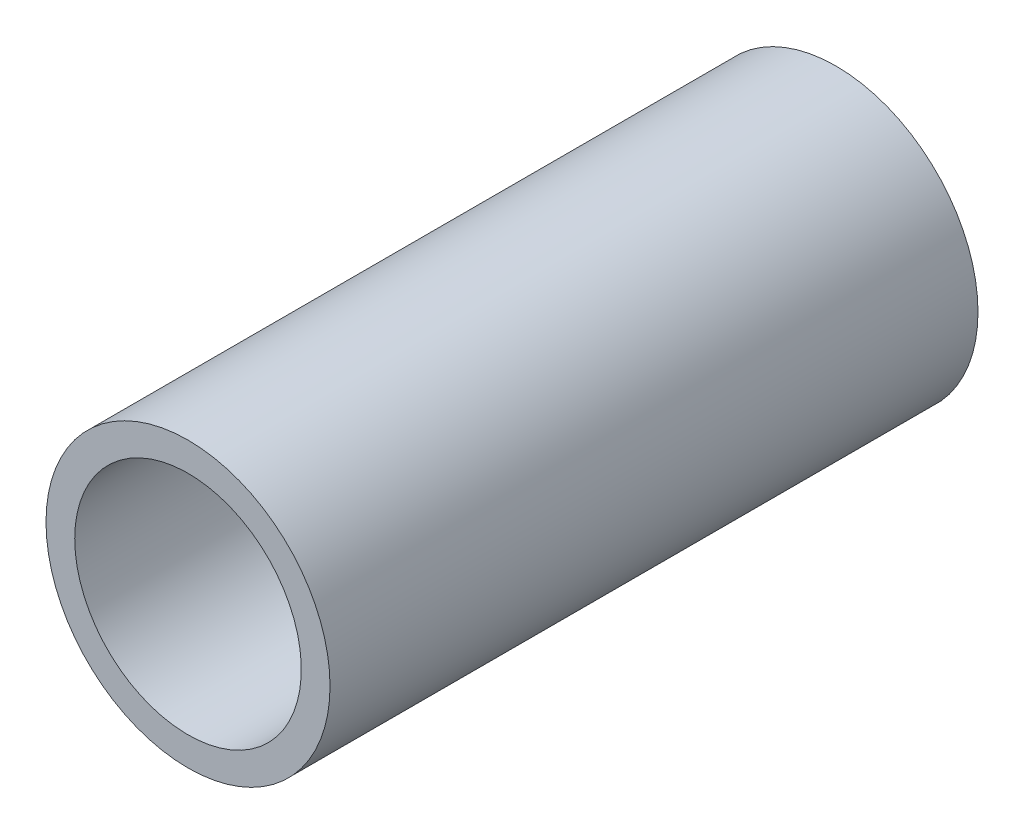
ISO-10303-21;
HEADER;
FILE_DESCRIPTION(('STEP AP214'),'2;1');
FILE_NAME('part.step','',(''),(''),'','','');
FILE_SCHEMA(('AUTOMOTIVE_DESIGN { 1 0 10303 214 1 1 1 1 }'));
ENDSEC;
DATA;
#1=APPLICATION_CONTEXT('core data for automotive mechanical design processes');
#2=APPLICATION_PROTOCOL_DEFINITION('international standard','automotive_design',2000,#1);
#3=PRODUCT_CONTEXT('',#1,'mechanical');
#4=PRODUCT('Part','Part','',(#3));
#5=PRODUCT_RELATED_PRODUCT_CATEGORY('part','',(#4));
#6=PRODUCT_DEFINITION_FORMATION('','',#4);
#7=PRODUCT_DEFINITION_CONTEXT('part definition',#1,'design');
#8=PRODUCT_DEFINITION('design','',#6,#7);
#9=PRODUCT_DEFINITION_SHAPE('','',#8);
#10=(LENGTH_UNIT() NAMED_UNIT(*) SI_UNIT(.MILLI.,.METRE.));
#11=(NAMED_UNIT(*) PLANE_ANGLE_UNIT() SI_UNIT($,.RADIAN.));
#12=(NAMED_UNIT(*) SI_UNIT($,.STERADIAN.) SOLID_ANGLE_UNIT());
#13=UNCERTAINTY_MEASURE_WITH_UNIT(LENGTH_MEASURE(1.E-05),#10,'distance_accuracy_value','');
#14=(GEOMETRIC_REPRESENTATION_CONTEXT(3) GLOBAL_UNCERTAINTY_ASSIGNED_CONTEXT((#13)) GLOBAL_UNIT_ASSIGNED_CONTEXT((#10,
#11,#12)) REPRESENTATION_CONTEXT('',''));
#15=CARTESIAN_POINT('',(0.,0.,0.));
#16=DIRECTION('',(0.,0.,1.));
#17=DIRECTION('',(1.,0.,0.));
#18=AXIS2_PLACEMENT_3D('',#15,#16,#17);
#19=CARTESIAN_POINT('',(0.,0.,38.1));
#20=DIRECTION('',(0.,0.,1.));
#21=DIRECTION('',(1.,0.,0.));
#22=AXIS2_PLACEMENT_3D('',#19,#20,#21);
#23=PLANE('',#22);
#24=CARTESIAN_POINT('',(0.,0.,38.1));
#25=DIRECTION('',(0.,0.,1.));
#26=DIRECTION('',(1.,0.,0.));
#27=AXIS2_PLACEMENT_3D('',#24,#25,#26);
#28=CIRCLE('',#27,16.7005);
#29=CARTESIAN_POINT('',(-16.7005,0.,38.1));
#30=VERTEX_POINT('',#29);
#31=EDGE_CURVE('E11',#30,#30,#28,.T.);
#32=ORIENTED_EDGE('',*,*,#31,.T.);
#33=EDGE_LOOP('',(#32));
#34=FACE_BOUND('',#33,.T.);
#35=CARTESIAN_POINT('',(0.,0.,38.1));
#36=DIRECTION('',(0.,0.,1.));
#37=DIRECTION('',(1.,0.,0.));
#38=AXIS2_PLACEMENT_3D('',#35,#36,#37);
#39=CIRCLE('',#38,13.3223);
#40=CARTESIAN_POINT('',(-13.3223,0.,38.1));
#41=VERTEX_POINT('',#40);
#42=EDGE_CURVE('E52',#41,#41,#39,.T.);
#43=ORIENTED_EDGE('',*,*,#42,.F.);
#44=EDGE_LOOP('',(#43));
#45=FACE_BOUND('',#44,.T.);
#46=ADVANCED_FACE('F41',(#34,#45),#23,.T.);
#47=CARTESIAN_POINT('',(0.,0.,-38.1));
#48=DIRECTION('',(0.,0.,1.));
#49=DIRECTION('',(1.,0.,0.));
#50=AXIS2_PLACEMENT_3D('',#47,#48,#49);
#51=PLANE('',#50);
#52=CARTESIAN_POINT('',(0.,0.,-38.1));
#53=DIRECTION('',(0.,0.,1.));
#54=DIRECTION('',(1.,0.,0.));
#55=AXIS2_PLACEMENT_3D('',#52,#53,#54);
#56=CIRCLE('',#55,16.7005);
#57=CARTESIAN_POINT('',(-16.7005,0.,-38.1));
#58=VERTEX_POINT('',#57);
#59=EDGE_CURVE('E45',#58,#58,#56,.T.);
#60=ORIENTED_EDGE('',*,*,#59,.F.);
#61=EDGE_LOOP('',(#60));
#62=FACE_BOUND('',#61,.T.);
#63=CARTESIAN_POINT('',(0.,0.,-38.1));
#64=DIRECTION('',(0.,0.,1.));
#65=DIRECTION('',(1.,0.,0.));
#66=AXIS2_PLACEMENT_3D('',#63,#64,#65);
#67=CIRCLE('',#66,13.3223);
#68=CARTESIAN_POINT('',(-13.3223,0.,-38.1));
#69=VERTEX_POINT('',#68);
#70=EDGE_CURVE('E54',#69,#69,#67,.T.);
#71=ORIENTED_EDGE('',*,*,#70,.T.);
#72=EDGE_LOOP('',(#71));
#73=FACE_BOUND('',#72,.T.);
#74=ADVANCED_FACE('F64',(#62,#73),#51,.F.);
#75=CARTESIAN_POINT('',(0.,0.,38.1));
#76=DIRECTION('',(0.,0.,-1.));
#77=DIRECTION('',(-1.,0.,0.));
#78=AXIS2_PLACEMENT_3D('',#75,#76,#77);
#79=CYLINDRICAL_SURFACE('',#78,16.7005);
#80=CARTESIAN_POINT('',(-16.7005,0.,38.1));
#81=CARTESIAN_POINT('',(-16.7005,0.,37.30625));
#82=CARTESIAN_POINT('',(-16.7005,0.,36.5125));
#83=CARTESIAN_POINT('',(-16.7005,0.,34.925));
#84=CARTESIAN_POINT('',(-16.7005,0.,34.13125));
#85=CARTESIAN_POINT('',(-16.7005,0.,32.54375));
#86=CARTESIAN_POINT('',(-16.7005,0.,31.75));
#87=CARTESIAN_POINT('',(-16.7005,0.,30.1625));
#88=CARTESIAN_POINT('',(-16.7005,0.,29.36875));
#89=CARTESIAN_POINT('',(-16.7005,0.,27.78125));
#90=CARTESIAN_POINT('',(-16.7005,0.,26.9875));
#91=CARTESIAN_POINT('',(-16.7005,0.,25.4));
#92=CARTESIAN_POINT('',(-16.7005,0.,24.60625));
#93=CARTESIAN_POINT('',(-16.7005,0.,23.01875));
#94=CARTESIAN_POINT('',(-16.7005,0.,22.225));
#95=CARTESIAN_POINT('',(-16.7005,0.,20.6375));
#96=CARTESIAN_POINT('',(-16.7005,0.,19.84375));
#97=CARTESIAN_POINT('',(-16.7005,0.,18.25625));
#98=CARTESIAN_POINT('',(-16.7005,0.,17.4625));
#99=CARTESIAN_POINT('',(-16.7005,0.,15.875));
#100=CARTESIAN_POINT('',(-16.7005,0.,15.08125));
#101=CARTESIAN_POINT('',(-16.7005,0.,13.49375));
#102=CARTESIAN_POINT('',(-16.7005,0.,12.7));
#103=CARTESIAN_POINT('',(-16.7005,0.,11.1125));
#104=CARTESIAN_POINT('',(-16.7005,0.,10.31875));
#105=CARTESIAN_POINT('',(-16.7005,0.,8.73124999999999));
#106=CARTESIAN_POINT('',(-16.7005,0.,7.93749999999999));
#107=CARTESIAN_POINT('',(-16.7005,0.,6.35));
#108=CARTESIAN_POINT('',(-16.7005,0.,5.55625));
#109=CARTESIAN_POINT('',(-16.7005,0.,3.96875));
#110=CARTESIAN_POINT('',(-16.7005,0.,3.175));
#111=CARTESIAN_POINT('',(-16.7005,0.,1.5875));
#112=CARTESIAN_POINT('',(-16.7005,0.,0.793750000000001));
#113=CARTESIAN_POINT('',(-16.7005,0.,-0.793750000000001));
#114=CARTESIAN_POINT('',(-16.7005,0.,-1.5875));
#115=CARTESIAN_POINT('',(-16.7005,0.,-3.175));
#116=CARTESIAN_POINT('',(-16.7005,0.,-3.96875));
#117=CARTESIAN_POINT('',(-16.7005,0.,-5.55625));
#118=CARTESIAN_POINT('',(-16.7005,0.,-6.35));
#119=CARTESIAN_POINT('',(-16.7005,0.,-7.93750000000001));
#120=CARTESIAN_POINT('',(-16.7005,0.,-8.73125));
#121=CARTESIAN_POINT('',(-16.7005,0.,-10.31875));
#122=CARTESIAN_POINT('',(-16.7005,0.,-11.1125));
#123=CARTESIAN_POINT('',(-16.7005,0.,-12.7));
#124=CARTESIAN_POINT('',(-16.7005,0.,-13.49375));
#125=CARTESIAN_POINT('',(-16.7005,0.,-15.08125));
#126=CARTESIAN_POINT('',(-16.7005,0.,-15.875));
#127=CARTESIAN_POINT('',(-16.7005,0.,-17.4625));
#128=CARTESIAN_POINT('',(-16.7005,0.,-18.25625));
#129=CARTESIAN_POINT('',(-16.7005,0.,-19.84375));
#130=CARTESIAN_POINT('',(-16.7005,0.,-20.6375));
#131=CARTESIAN_POINT('',(-16.7005,0.,-22.225));
#132=CARTESIAN_POINT('',(-16.7005,0.,-23.01875));
#133=CARTESIAN_POINT('',(-16.7005,0.,-24.60625));
#134=CARTESIAN_POINT('',(-16.7005,0.,-25.4));
#135=CARTESIAN_POINT('',(-16.7005,0.,-26.9875));
#136=CARTESIAN_POINT('',(-16.7005,0.,-27.78125));
#137=CARTESIAN_POINT('',(-16.7005,0.,-29.36875));
#138=CARTESIAN_POINT('',(-16.7005,0.,-30.1625));
#139=CARTESIAN_POINT('',(-16.7005,0.,-31.75));
#140=CARTESIAN_POINT('',(-16.7005,0.,-32.54375));
#141=CARTESIAN_POINT('',(-16.7005,0.,-34.13125));
#142=CARTESIAN_POINT('',(-16.7005,0.,-34.925));
#143=CARTESIAN_POINT('',(-16.7005,0.,-36.5125));
#144=CARTESIAN_POINT('',(-16.7005,0.,-37.30625));
#145=CARTESIAN_POINT('',(-16.7005,0.,-38.1));
#146=B_SPLINE_CURVE_WITH_KNOTS('',3,(#80,#81,#82,#83,#84,#85,#86,#87,#88,#89,#90,#91,#92,#93,
#94,#95,#96,#97,#98,#99,#100,#101,#102,#103,#104,#105,#106,#107,#108,#109,#110,#111,#112,#113,
#114,#115,#116,#117,#118,#119,#120,#121,#122,#123,#124,#125,#126,#127,#128,#129,#130,#131,#132,
#133,#134,#135,#136,#137,#138,#139,#140,#141,#142,#143,#144,#145),.UNSPECIFIED.,.F.,.F.,(4,2,2,
2,2,2,2,2,2,2,2,2,2,2,2,2,2,2,2,2,2,2,2,2,2,2,2,2,2,2,2,2,4),(0.,2.38125,4.7625,7.14375,
9.52500000000001,11.90625,14.2875,16.66875,19.05,21.43125,23.8125,26.19375,28.575,30.95625,
33.3375,35.71875,38.1,40.48125,42.8625,45.24375,47.625,50.00625,52.3875,54.76875,57.15,59.53125,
61.9125,64.29375,66.675,69.05625,71.4375,73.81875,76.2),.UNSPECIFIED.);
#147=EDGE_CURVE('BSEAM43',#30,#58,#146,.T.);
#148=ORIENTED_EDGE('',*,*,#31,.F.);
#149=ORIENTED_EDGE('',*,*,#59,.T.);
#150=ORIENTED_EDGE('',*,*,#147,.T.);
#151=ORIENTED_EDGE('',*,*,#147,.F.);
#152=EDGE_LOOP('',(#148,#150,#149,#151));
#153=FACE_BOUND('',#152,.T.);
#154=ADVANCED_FACE('F43',(#153),#79,.T.);
#155=CARTESIAN_POINT('',(0.,0.,38.1));
#156=DIRECTION('',(0.,0.,-1.));
#157=DIRECTION('',(-1.,0.,0.));
#158=AXIS2_PLACEMENT_3D('',#155,#156,#157);
#159=CYLINDRICAL_SURFACE('',#158,13.3223);
#160=CARTESIAN_POINT('',(-13.3223,0.,38.1));
#161=CARTESIAN_POINT('',(-13.3223,0.,37.30625));
#162=CARTESIAN_POINT('',(-13.3223,0.,36.5125));
#163=CARTESIAN_POINT('',(-13.3223,0.,34.925));
#164=CARTESIAN_POINT('',(-13.3223,0.,34.13125));
#165=CARTESIAN_POINT('',(-13.3223,0.,32.54375));
#166=CARTESIAN_POINT('',(-13.3223,0.,31.75));
#167=CARTESIAN_POINT('',(-13.3223,0.,30.1625));
#168=CARTESIAN_POINT('',(-13.3223,0.,29.36875));
#169=CARTESIAN_POINT('',(-13.3223,0.,27.78125));
#170=CARTESIAN_POINT('',(-13.3223,0.,26.9875));
#171=CARTESIAN_POINT('',(-13.3223,0.,25.4));
#172=CARTESIAN_POINT('',(-13.3223,0.,24.60625));
#173=CARTESIAN_POINT('',(-13.3223,0.,23.01875));
#174=CARTESIAN_POINT('',(-13.3223,0.,22.225));
#175=CARTESIAN_POINT('',(-13.3223,0.,20.6375));
#176=CARTESIAN_POINT('',(-13.3223,0.,19.84375));
#177=CARTESIAN_POINT('',(-13.3223,0.,18.25625));
#178=CARTESIAN_POINT('',(-13.3223,0.,17.4625));
#179=CARTESIAN_POINT('',(-13.3223,0.,15.875));
#180=CARTESIAN_POINT('',(-13.3223,0.,15.08125));
#181=CARTESIAN_POINT('',(-13.3223,0.,13.49375));
#182=CARTESIAN_POINT('',(-13.3223,0.,12.7));
#183=CARTESIAN_POINT('',(-13.3223,0.,11.1125));
#184=CARTESIAN_POINT('',(-13.3223,0.,10.31875));
#185=CARTESIAN_POINT('',(-13.3223,0.,8.73124999999999));
#186=CARTESIAN_POINT('',(-13.3223,0.,7.93749999999999));
#187=CARTESIAN_POINT('',(-13.3223,0.,6.35));
#188=CARTESIAN_POINT('',(-13.3223,0.,5.55625));
#189=CARTESIAN_POINT('',(-13.3223,0.,3.96875));
#190=CARTESIAN_POINT('',(-13.3223,0.,3.175));
#191=CARTESIAN_POINT('',(-13.3223,0.,1.5875));
#192=CARTESIAN_POINT('',(-13.3223,0.,0.793750000000001));
#193=CARTESIAN_POINT('',(-13.3223,0.,-0.793750000000001));
#194=CARTESIAN_POINT('',(-13.3223,0.,-1.5875));
#195=CARTESIAN_POINT('',(-13.3223,0.,-3.175));
#196=CARTESIAN_POINT('',(-13.3223,0.,-3.96875));
#197=CARTESIAN_POINT('',(-13.3223,0.,-5.55625));
#198=CARTESIAN_POINT('',(-13.3223,0.,-6.35));
#199=CARTESIAN_POINT('',(-13.3223,0.,-7.93750000000001));
#200=CARTESIAN_POINT('',(-13.3223,0.,-8.73125));
#201=CARTESIAN_POINT('',(-13.3223,0.,-10.31875));
#202=CARTESIAN_POINT('',(-13.3223,0.,-11.1125));
#203=CARTESIAN_POINT('',(-13.3223,0.,-12.7));
#204=CARTESIAN_POINT('',(-13.3223,0.,-13.49375));
#205=CARTESIAN_POINT('',(-13.3223,0.,-15.08125));
#206=CARTESIAN_POINT('',(-13.3223,0.,-15.875));
#207=CARTESIAN_POINT('',(-13.3223,0.,-17.4625));
#208=CARTESIAN_POINT('',(-13.3223,0.,-18.25625));
#209=CARTESIAN_POINT('',(-13.3223,0.,-19.84375));
#210=CARTESIAN_POINT('',(-13.3223,0.,-20.6375));
#211=CARTESIAN_POINT('',(-13.3223,0.,-22.225));
#212=CARTESIAN_POINT('',(-13.3223,0.,-23.01875));
#213=CARTESIAN_POINT('',(-13.3223,0.,-24.60625));
#214=CARTESIAN_POINT('',(-13.3223,0.,-25.4));
#215=CARTESIAN_POINT('',(-13.3223,0.,-26.9875));
#216=CARTESIAN_POINT('',(-13.3223,0.,-27.78125));
#217=CARTESIAN_POINT('',(-13.3223,0.,-29.36875));
#218=CARTESIAN_POINT('',(-13.3223,0.,-30.1625));
#219=CARTESIAN_POINT('',(-13.3223,0.,-31.75));
#220=CARTESIAN_POINT('',(-13.3223,0.,-32.54375));
#221=CARTESIAN_POINT('',(-13.3223,0.,-34.13125));
#222=CARTESIAN_POINT('',(-13.3223,0.,-34.925));
#223=CARTESIAN_POINT('',(-13.3223,0.,-36.5125));
#224=CARTESIAN_POINT('',(-13.3223,0.,-37.30625));
#225=CARTESIAN_POINT('',(-13.3223,0.,-38.1));
#226=B_SPLINE_CURVE_WITH_KNOTS('',3,(#160,#161,#162,#163,#164,#165,#166,#167,#168,#169,#170,
#171,#172,#173,#174,#175,#176,#177,#178,#179,#180,#181,#182,#183,#184,#185,#186,#187,#188,#189,
#190,#191,#192,#193,#194,#195,#196,#197,#198,#199,#200,#201,#202,#203,#204,#205,#206,#207,#208,
#209,#210,#211,#212,#213,#214,#215,#216,#217,#218,#219,#220,#221,#222,#223,#224,#225),
.UNSPECIFIED.,.F.,.F.,(4,2,2,2,2,2,2,2,2,2,2,2,2,2,2,2,2,2,2,2,2,2,2,2,2,2,2,2,2,2,2,2,4),(0.,
2.38125,4.7625,7.14375,9.52500000000001,11.90625,14.2875,16.66875,19.05,21.43125,23.8125,
26.19375,28.575,30.95625,33.3375,35.71875,38.1,40.48125,42.8625,45.24375,47.625,50.00625,
52.3875,54.76875,57.15,59.53125,61.9125,64.29375,66.675,69.05625,71.4375,73.81875,76.2),.UNSPECIFIED.);
#227=EDGE_CURVE('BSEAM60',#41,#69,#226,.T.);
#228=ORIENTED_EDGE('',*,*,#42,.T.);
#229=ORIENTED_EDGE('',*,*,#70,.F.);
#230=ORIENTED_EDGE('',*,*,#227,.T.);
#231=ORIENTED_EDGE('',*,*,#227,.F.);
#232=EDGE_LOOP('',(#228,#230,#229,#231));
#233=FACE_BOUND('',#232,.T.);
#234=ADVANCED_FACE('F60',(#233),#159,.F.);
#235=CLOSED_SHELL('',(#46,#74,#154,#234));
#236=MANIFOLD_SOLID_BREP('B2',#235);
#237=ADVANCED_BREP_SHAPE_REPRESENTATION('',(#18,#236),#14);
#238=SHAPE_DEFINITION_REPRESENTATION(#9,#237);
ENDSEC;
END-ISO-10303-21;
